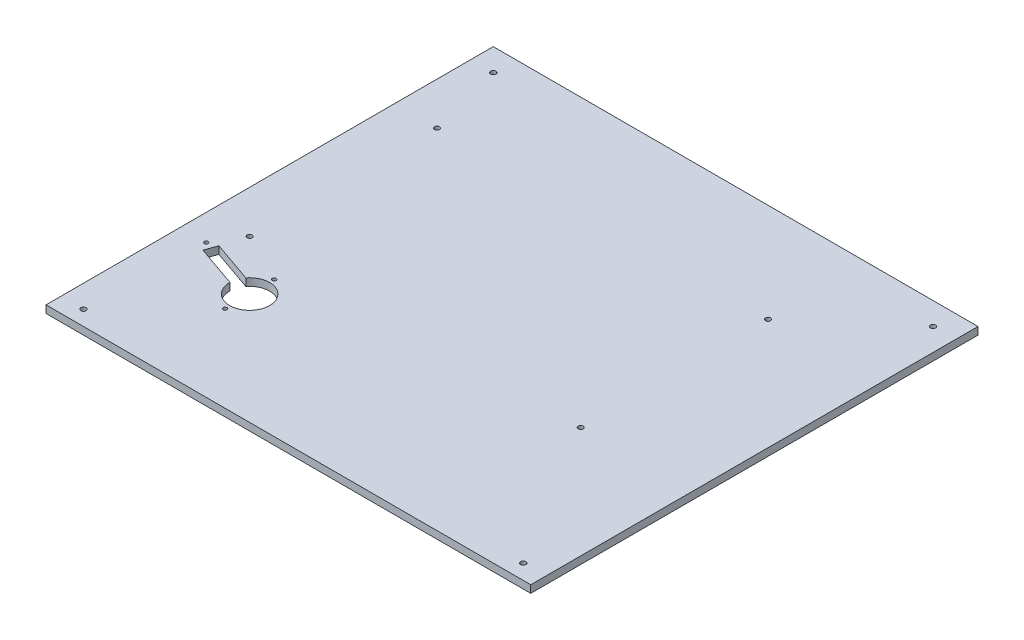
ISO-10303-21;
HEADER;
FILE_DESCRIPTION(('STEP AP214'),'2;1');
FILE_NAME('part.step','',(''),(''),'','','');
FILE_SCHEMA(('AUTOMOTIVE_DESIGN { 1 0 10303 214 1 1 1 1 }'));
ENDSEC;
DATA;
#1=APPLICATION_CONTEXT('core data for automotive mechanical design processes');
#2=APPLICATION_PROTOCOL_DEFINITION('international standard','automotive_design',2000,#1);
#3=PRODUCT_CONTEXT('',#1,'mechanical');
#4=PRODUCT('Part','Part','',(#3));
#5=PRODUCT_RELATED_PRODUCT_CATEGORY('part','',(#4));
#6=PRODUCT_DEFINITION_FORMATION('','',#4);
#7=PRODUCT_DEFINITION_CONTEXT('part definition',#1,'design');
#8=PRODUCT_DEFINITION('design','',#6,#7);
#9=PRODUCT_DEFINITION_SHAPE('','',#8);
#10=(LENGTH_UNIT() NAMED_UNIT(*) SI_UNIT(.MILLI.,.METRE.));
#11=(NAMED_UNIT(*) PLANE_ANGLE_UNIT() SI_UNIT($,.RADIAN.));
#12=(NAMED_UNIT(*) SI_UNIT($,.STERADIAN.) SOLID_ANGLE_UNIT());
#13=UNCERTAINTY_MEASURE_WITH_UNIT(LENGTH_MEASURE(1.E-05),#10,'distance_accuracy_value','');
#14=(GEOMETRIC_REPRESENTATION_CONTEXT(3) GLOBAL_UNCERTAINTY_ASSIGNED_CONTEXT((#13)) GLOBAL_UNIT_ASSIGNED_CONTEXT((#10,
#11,#12)) REPRESENTATION_CONTEXT('',''));
#15=CARTESIAN_POINT('',(0.,0.,0.));
#16=DIRECTION('',(0.,0.,1.));
#17=DIRECTION('',(1.,0.,0.));
#18=AXIS2_PLACEMENT_3D('',#15,#16,#17);
#19=CARTESIAN_POINT('',(0.,6.,0.));
#20=DIRECTION('',(0.,1.,0.));
#21=DIRECTION('',(0.,0.,1.));
#22=AXIS2_PLACEMENT_3D('',#19,#20,#21);
#23=PLANE('',#22);
#24=DIRECTION('',(0.,0.,1.));
#25=VECTOR('',#24,1.);
#26=CARTESIAN_POINT('',(194.,6.,179.));
#27=LINE('',#26,#25);
#28=CARTESIAN_POINT('',(194.,6.,-179.));
#29=VERTEX_POINT('',#28);
#30=CARTESIAN_POINT('',(194.,6.,179.));
#31=VERTEX_POINT('',#30);
#32=EDGE_CURVE('E123',#29,#31,#27,.T.);
#33=ORIENTED_EDGE('',*,*,#32,.F.);
#34=DIRECTION('',(1.,0.,0.));
#35=VECTOR('',#34,1.);
#36=CARTESIAN_POINT('',(194.,6.,-179.));
#37=LINE('',#36,#35);
#38=CARTESIAN_POINT('',(-194.,6.,-179.));
#39=VERTEX_POINT('',#38);
#40=EDGE_CURVE('E129',#39,#29,#37,.T.);
#41=ORIENTED_EDGE('',*,*,#40,.F.);
#42=DIRECTION('',(0.,0.,-1.));
#43=VECTOR('',#42,1.);
#44=CARTESIAN_POINT('',(-194.,6.,-179.));
#45=LINE('',#44,#43);
#46=CARTESIAN_POINT('',(-194.,6.,179.));
#47=VERTEX_POINT('',#46);
#48=EDGE_CURVE('E106',#47,#39,#45,.T.);
#49=ORIENTED_EDGE('',*,*,#48,.F.);
#50=DIRECTION('',(-1.,0.,0.));
#51=VECTOR('',#50,1.);
#52=CARTESIAN_POINT('',(-195.,6.,179.));
#53=LINE('',#52,#51);
#54=EDGE_CURVE('E137',#31,#47,#53,.T.);
#55=ORIENTED_EDGE('',*,*,#54,.F.);
#56=EDGE_LOOP('',(#33,#41,#49,#55));
#57=FACE_BOUND('',#56,.T.);
#58=DIRECTION('',(-0.94497601466594,0.,-0.327139621119298));
#59=VECTOR('',#58,1.);
#60=CARTESIAN_POINT('',(-165.800861457383,6.,68.8531564650416));
#61=LINE('',#60,#59);
#62=CARTESIAN_POINT('',(-132.726704425269,6.,80.3030419990685));
#63=VERTEX_POINT('',#62);
#64=CARTESIAN_POINT('',(-165.800861457383,6.,68.8531564650416));
#65=VERTEX_POINT('',#64);
#66=EDGE_CURVE('E153',#63,#65,#61,.T.);
#67=ORIENTED_EDGE('',*,*,#66,.F.);
#68=CARTESIAN_POINT('',(-120.,6.,90.));
#69=DIRECTION('',(0.,1.,0.));
#70=DIRECTION('',(0.,0.,1.));
#71=AXIS2_PLACEMENT_3D('',#68,#69,#70);
#72=CIRCLE('',#71,16.);
#73=CARTESIAN_POINT('',(-135.998409614238,6.,89.7744122896263));
#74=VERTEX_POINT('',#73);
#75=EDGE_CURVE('E216',#74,#63,#72,.T.);
#76=ORIENTED_EDGE('',*,*,#75,.F.);
#77=DIRECTION('',(0.944784063141577,0.,0.327693567275425));
#78=VECTOR('',#77,1.);
#79=CARTESIAN_POINT('',(-135.998409614238,6.,89.7744122896263));
#80=LINE('',#79,#78);
#81=CARTESIAN_POINT('',(-169.072254333184,6.,78.3029167571695));
#82=VERTEX_POINT('',#81);
#83=EDGE_CURVE('E64',#82,#74,#80,.T.);
#84=ORIENTED_EDGE('',*,*,#83,.F.);
#85=DIRECTION('',(-0.327139318778484,0.,0.944976119332732));
#86=VECTOR('',#85,1.);
#87=CARTESIAN_POINT('',(-169.072254333184,6.,78.3029167571695));
#88=LINE('',#87,#86);
#89=EDGE_CURVE('E152',#65,#82,#88,.T.);
#90=ORIENTED_EDGE('',*,*,#89,.F.);
#91=EDGE_LOOP('',(#67,#76,#84,#90));
#92=FACE_BOUND('',#91,.T.);
#93=CARTESIAN_POINT('',(-120.315809278969,6.,70.0024935429611));
#94=DIRECTION('',(0.,1.,0.));
#95=DIRECTION('',(0.,0.,1.));
#96=AXIS2_PLACEMENT_3D('',#93,#94,#95);
#97=CIRCLE('',#96,1.54999999999999);
#98=CARTESIAN_POINT('',(-120.315809278969,6.,71.5524935429611));
#99=VERTEX_POINT('',#98);
#100=EDGE_CURVE('E171',#99,#99,#97,.T.);
#101=ORIENTED_EDGE('',*,*,#100,.F.);
#102=EDGE_LOOP('',(#101));
#103=FACE_BOUND('',#102,.T.);
#104=CARTESIAN_POINT('',(105.,6.,-99.9999999999999));
#105=DIRECTION('',(0.,1.,0.));
#106=DIRECTION('',(0.,0.,1.));
#107=AXIS2_PLACEMENT_3D('',#104,#105,#106);
#108=CIRCLE('',#107,1.99999999999648);
#109=CARTESIAN_POINT('',(105.,6.,-98.0000000000035));
#110=VERTEX_POINT('',#109);
#111=EDGE_CURVE('E182',#110,#110,#108,.T.);
#112=ORIENTED_EDGE('',*,*,#111,.F.);
#113=EDGE_LOOP('',(#112));
#114=FACE_BOUND('',#113,.T.);
#115=CARTESIAN_POINT('',(-160.,6.,-100.));
#116=DIRECTION('',(0.,1.,0.));
#117=DIRECTION('',(0.,0.,1.));
#118=AXIS2_PLACEMENT_3D('',#115,#116,#117);
#119=CIRCLE('',#118,1.99999999999648);
#120=CARTESIAN_POINT('',(-160.,6.,-98.0000000000035));
#121=VERTEX_POINT('',#120);
#122=EDGE_CURVE('E193',#121,#121,#119,.T.);
#123=ORIENTED_EDGE('',*,*,#122,.F.);
#124=EDGE_LOOP('',(#123));
#125=FACE_BOUND('',#124,.T.);
#126=CARTESIAN_POINT('',(176.,6.,-161.));
#127=DIRECTION('',(0.,1.,0.));
#128=DIRECTION('',(0.,0.,-1.));
#129=AXIS2_PLACEMENT_3D('',#126,#127,#128);
#130=CIRCLE('',#129,2.09999999999999);
#131=CARTESIAN_POINT('',(176.,6.,-163.1));
#132=VERTEX_POINT('',#131);
#133=EDGE_CURVE('E210',#132,#132,#130,.T.);
#134=ORIENTED_EDGE('',*,*,#133,.F.);
#135=EDGE_LOOP('',(#134));
#136=FACE_BOUND('',#135,.T.);
#137=CARTESIAN_POINT('',(-176.,6.,-161.));
#138=DIRECTION('',(0.,1.,0.));
#139=DIRECTION('',(0.,0.,1.));
#140=AXIS2_PLACEMENT_3D('',#137,#138,#139);
#141=CIRCLE('',#140,2.09999999999999);
#142=CARTESIAN_POINT('',(-176.,6.,-158.9));
#143=VERTEX_POINT('',#142);
#144=EDGE_CURVE('E11',#143,#143,#141,.T.);
#145=ORIENTED_EDGE('',*,*,#144,.F.);
#146=EDGE_LOOP('',(#145));
#147=FACE_BOUND('',#146,.T.);
#148=CARTESIAN_POINT('',(-176.,6.,167.));
#149=DIRECTION('',(0.,1.,0.));
#150=DIRECTION('',(0.,0.,1.));
#151=AXIS2_PLACEMENT_3D('',#148,#149,#150);
#152=CIRCLE('',#151,2.09999999999999);
#153=CARTESIAN_POINT('',(-176.,6.,169.1));
#154=VERTEX_POINT('',#153);
#155=EDGE_CURVE('E221',#154,#154,#152,.T.);
#156=ORIENTED_EDGE('',*,*,#155,.F.);
#157=EDGE_LOOP('',(#156));
#158=FACE_BOUND('',#157,.T.);
#159=CARTESIAN_POINT('',(176.,6.,167.));
#160=DIRECTION('',(0.,1.,0.));
#161=DIRECTION('',(0.,0.,-1.));
#162=AXIS2_PLACEMENT_3D('',#159,#160,#161);
#163=CIRCLE('',#162,2.09999999999999);
#164=CARTESIAN_POINT('',(176.,6.,164.9));
#165=VERTEX_POINT('',#164);
#166=EDGE_CURVE('E215',#165,#165,#163,.T.);
#167=ORIENTED_EDGE('',*,*,#166,.F.);
#168=EDGE_LOOP('',(#167));
#169=FACE_BOUND('',#168,.T.);
#170=CARTESIAN_POINT('',(-160.,6.,50.));
#171=DIRECTION('',(0.,1.,0.));
#172=DIRECTION('',(0.,0.,1.));
#173=AXIS2_PLACEMENT_3D('',#170,#171,#172);
#174=CIRCLE('',#173,1.99999999999648);
#175=CARTESIAN_POINT('',(-160.,6.,51.9999999999965));
#176=VERTEX_POINT('',#175);
#177=EDGE_CURVE('E202',#176,#176,#174,.T.);
#178=ORIENTED_EDGE('',*,*,#177,.F.);
#179=EDGE_LOOP('',(#178));
#180=FACE_BOUND('',#179,.T.);
#181=CARTESIAN_POINT('',(105.,6.,50.));
#182=DIRECTION('',(0.,1.,0.));
#183=DIRECTION('',(0.,0.,1.));
#184=AXIS2_PLACEMENT_3D('',#181,#182,#183);
#185=CIRCLE('',#184,1.99999999999648);
#186=CARTESIAN_POINT('',(105.,6.,51.9999999999965));
#187=VERTEX_POINT('',#186);
#188=EDGE_CURVE('E186',#187,#187,#185,.T.);
#189=ORIENTED_EDGE('',*,*,#188,.F.);
#190=EDGE_LOOP('',(#189));
#191=FACE_BOUND('',#190,.T.);
#192=CARTESIAN_POINT('',(-119.684190721031,6.,109.997506457039));
#193=DIRECTION('',(0.,1.,0.));
#194=DIRECTION('',(0.,0.,1.));
#195=AXIS2_PLACEMENT_3D('',#192,#193,#194);
#196=CIRCLE('',#195,1.54999999999999);
#197=CARTESIAN_POINT('',(-119.684190721031,6.,111.547506457039));
#198=VERTEX_POINT('',#197);
#199=EDGE_CURVE('E180',#198,#198,#196,.T.);
#200=ORIENTED_EDGE('',*,*,#199,.F.);
#201=EDGE_LOOP('',(#200));
#202=FACE_BOUND('',#201,.T.);
#203=CARTESIAN_POINT('',(-173.10641461128,6.,71.6152006984346));
#204=DIRECTION('',(0.,1.,0.));
#205=DIRECTION('',(0.,0.,1.));
#206=AXIS2_PLACEMENT_3D('',#203,#204,#205);
#207=CIRCLE('',#206,1.5500000000041);
#208=CARTESIAN_POINT('',(-173.10641461128,6.,73.1652006984388));
#209=VERTEX_POINT('',#208);
#210=EDGE_CURVE('E164',#209,#209,#207,.T.);
#211=ORIENTED_EDGE('',*,*,#210,.F.);
#212=EDGE_LOOP('',(#211));
#213=FACE_BOUND('',#212,.T.);
#214=ADVANCED_FACE('F39',(#57,#92,#103,#114,#125,#136,#147,#158,#169,#180,#191,#202,#213),#23,.T.);
#215=CARTESIAN_POINT('',(0.,0.,0.));
#216=DIRECTION('',(0.,1.,0.));
#217=DIRECTION('',(0.,0.,1.));
#218=AXIS2_PLACEMENT_3D('',#215,#216,#217);
#219=PLANE('',#218);
#220=DIRECTION('',(1.,0.,0.));
#221=VECTOR('',#220,1.);
#222=CARTESIAN_POINT('',(194.,0.,-179.));
#223=LINE('',#222,#221);
#224=CARTESIAN_POINT('',(-194.,0.,-179.));
#225=VERTEX_POINT('',#224);
#226=CARTESIAN_POINT('',(194.,0.,-179.));
#227=VERTEX_POINT('',#226);
#228=EDGE_CURVE('E112',#225,#227,#223,.T.);
#229=ORIENTED_EDGE('',*,*,#228,.T.);
#230=DIRECTION('',(0.,0.,1.));
#231=VECTOR('',#230,1.);
#232=CARTESIAN_POINT('',(194.,0.,179.));
#233=LINE('',#232,#231);
#234=CARTESIAN_POINT('',(194.,0.,179.));
#235=VERTEX_POINT('',#234);
#236=EDGE_CURVE('E118',#227,#235,#233,.T.);
#237=ORIENTED_EDGE('',*,*,#236,.T.);
#238=DIRECTION('',(-1.,0.,0.));
#239=VECTOR('',#238,1.);
#240=CARTESIAN_POINT('',(-195.,0.,179.));
#241=LINE('',#240,#239);
#242=CARTESIAN_POINT('',(-194.,0.,179.));
#243=VERTEX_POINT('',#242);
#244=EDGE_CURVE('E121',#235,#243,#241,.T.);
#245=ORIENTED_EDGE('',*,*,#244,.T.);
#246=DIRECTION('',(0.,0.,-1.));
#247=VECTOR('',#246,1.);
#248=CARTESIAN_POINT('',(-194.,0.,-179.));
#249=LINE('',#248,#247);
#250=EDGE_CURVE('E53',#243,#225,#249,.T.);
#251=ORIENTED_EDGE('',*,*,#250,.T.);
#252=EDGE_LOOP('',(#229,#237,#245,#251));
#253=FACE_BOUND('',#252,.T.);
#254=CARTESIAN_POINT('',(-176.,0.,-161.));
#255=DIRECTION('',(0.,1.,0.));
#256=DIRECTION('',(0.,0.,1.));
#257=AXIS2_PLACEMENT_3D('',#254,#255,#256);
#258=CIRCLE('',#257,2.09999999999999);
#259=CARTESIAN_POINT('',(-176.,0.,-158.9));
#260=VERTEX_POINT('',#259);
#261=EDGE_CURVE('E43',#260,#260,#258,.T.);
#262=ORIENTED_EDGE('',*,*,#261,.T.);
#263=EDGE_LOOP('',(#262));
#264=FACE_BOUND('',#263,.T.);
#265=CARTESIAN_POINT('',(-176.,0.,167.));
#266=DIRECTION('',(0.,1.,0.));
#267=DIRECTION('',(0.,0.,1.));
#268=AXIS2_PLACEMENT_3D('',#265,#266,#267);
#269=CIRCLE('',#268,2.09999999999999);
#270=CARTESIAN_POINT('',(-176.,0.,169.1));
#271=VERTEX_POINT('',#270);
#272=EDGE_CURVE('E225',#271,#271,#269,.T.);
#273=ORIENTED_EDGE('',*,*,#272,.T.);
#274=EDGE_LOOP('',(#273));
#275=FACE_BOUND('',#274,.T.);
#276=CARTESIAN_POINT('',(-120.,0.,90.));
#277=DIRECTION('',(0.,1.,0.));
#278=DIRECTION('',(0.,0.,1.));
#279=AXIS2_PLACEMENT_3D('',#276,#277,#278);
#280=CIRCLE('',#279,16.);
#281=CARTESIAN_POINT('',(-135.998409614238,0.,89.7744122896263));
#282=VERTEX_POINT('',#281);
#283=CARTESIAN_POINT('',(-132.726704425269,0.,80.3030419990685));
#284=VERTEX_POINT('',#283);
#285=EDGE_CURVE('E217',#282,#284,#280,.T.);
#286=ORIENTED_EDGE('',*,*,#285,.T.);
#287=DIRECTION('',(0.94497601466594,0.,0.327139621119298));
#288=VECTOR('',#287,1.);
#289=CARTESIAN_POINT('',(-165.800861457383,0.,68.8531564650416));
#290=LINE('',#289,#288);
#291=CARTESIAN_POINT('',(-165.800861457383,0.,68.8531564650416));
#292=VERTEX_POINT('',#291);
#293=EDGE_CURVE('E146',#292,#284,#290,.T.);
#294=ORIENTED_EDGE('',*,*,#293,.F.);
#295=DIRECTION('',(0.327139318778484,0.,-0.944976119332732));
#296=VECTOR('',#295,1.);
#297=CARTESIAN_POINT('',(-169.072254333184,0.,78.3029167571695));
#298=LINE('',#297,#296);
#299=CARTESIAN_POINT('',(-169.072254333184,0.,78.3029167571695));
#300=VERTEX_POINT('',#299);
#301=EDGE_CURVE('E149',#300,#292,#298,.T.);
#302=ORIENTED_EDGE('',*,*,#301,.F.);
#303=DIRECTION('',(-0.944784063141577,0.,-0.327693567275425));
#304=VECTOR('',#303,1.);
#305=CARTESIAN_POINT('',(-135.998409614238,0.,89.7744122896263));
#306=LINE('',#305,#304);
#307=EDGE_CURVE('E163',#282,#300,#306,.T.);
#308=ORIENTED_EDGE('',*,*,#307,.F.);
#309=EDGE_LOOP('',(#286,#294,#302,#308));
#310=FACE_BOUND('',#309,.T.);
#311=CARTESIAN_POINT('',(176.,0.,167.));
#312=DIRECTION('',(0.,1.,0.));
#313=DIRECTION('',(0.,0.,-1.));
#314=AXIS2_PLACEMENT_3D('',#311,#312,#313);
#315=CIRCLE('',#314,2.09999999999999);
#316=CARTESIAN_POINT('',(176.,0.,164.9));
#317=VERTEX_POINT('',#316);
#318=EDGE_CURVE('E208',#317,#317,#315,.T.);
#319=ORIENTED_EDGE('',*,*,#318,.T.);
#320=EDGE_LOOP('',(#319));
#321=FACE_BOUND('',#320,.T.);
#322=CARTESIAN_POINT('',(176.,0.,-161.));
#323=DIRECTION('',(0.,1.,0.));
#324=DIRECTION('',(0.,0.,-1.));
#325=AXIS2_PLACEMENT_3D('',#322,#323,#324);
#326=CIRCLE('',#325,2.09999999999999);
#327=CARTESIAN_POINT('',(176.,0.,-163.1));
#328=VERTEX_POINT('',#327);
#329=EDGE_CURVE('E204',#328,#328,#326,.T.);
#330=ORIENTED_EDGE('',*,*,#329,.T.);
#331=EDGE_LOOP('',(#330));
#332=FACE_BOUND('',#331,.T.);
#333=CARTESIAN_POINT('',(-160.,0.,50.));
#334=DIRECTION('',(0.,1.,0.));
#335=DIRECTION('',(0.,0.,1.));
#336=AXIS2_PLACEMENT_3D('',#333,#334,#335);
#337=CIRCLE('',#336,1.99999999999648);
#338=CARTESIAN_POINT('',(-160.,0.,51.9999999999965));
#339=VERTEX_POINT('',#338);
#340=EDGE_CURVE('E200',#339,#339,#337,.T.);
#341=ORIENTED_EDGE('',*,*,#340,.T.);
#342=EDGE_LOOP('',(#341));
#343=FACE_BOUND('',#342,.T.);
#344=CARTESIAN_POINT('',(-160.,0.,-100.));
#345=DIRECTION('',(0.,1.,0.));
#346=DIRECTION('',(0.,0.,1.));
#347=AXIS2_PLACEMENT_3D('',#344,#345,#346);
#348=CIRCLE('',#347,1.99999999999648);
#349=CARTESIAN_POINT('',(-160.,0.,-98.0000000000035));
#350=VERTEX_POINT('',#349);
#351=EDGE_CURVE('E194',#350,#350,#348,.T.);
#352=ORIENTED_EDGE('',*,*,#351,.T.);
#353=EDGE_LOOP('',(#352));
#354=FACE_BOUND('',#353,.T.);
#355=CARTESIAN_POINT('',(105.,0.,50.));
#356=DIRECTION('',(0.,1.,0.));
#357=DIRECTION('',(0.,0.,1.));
#358=AXIS2_PLACEMENT_3D('',#355,#356,#357);
#359=CIRCLE('',#358,1.99999999999648);
#360=CARTESIAN_POINT('',(105.,0.,51.9999999999965));
#361=VERTEX_POINT('',#360);
#362=EDGE_CURVE('E187',#361,#361,#359,.T.);
#363=ORIENTED_EDGE('',*,*,#362,.T.);
#364=EDGE_LOOP('',(#363));
#365=FACE_BOUND('',#364,.T.);
#366=CARTESIAN_POINT('',(105.,0.,-99.9999999999999));
#367=DIRECTION('',(0.,1.,0.));
#368=DIRECTION('',(0.,0.,1.));
#369=AXIS2_PLACEMENT_3D('',#366,#367,#368);
#370=CIRCLE('',#369,1.99999999999648);
#371=CARTESIAN_POINT('',(105.,0.,-98.0000000000035));
#372=VERTEX_POINT('',#371);
#373=EDGE_CURVE('E179',#372,#372,#370,.T.);
#374=ORIENTED_EDGE('',*,*,#373,.T.);
#375=EDGE_LOOP('',(#374));
#376=FACE_BOUND('',#375,.T.);
#377=CARTESIAN_POINT('',(-119.684190721031,0.,109.997506457039));
#378=DIRECTION('',(0.,1.,0.));
#379=DIRECTION('',(0.,0.,1.));
#380=AXIS2_PLACEMENT_3D('',#377,#378,#379);
#381=CIRCLE('',#380,1.54999999999999);
#382=CARTESIAN_POINT('',(-119.684190721031,0.,111.547506457039));
#383=VERTEX_POINT('',#382);
#384=EDGE_CURVE('E172',#383,#383,#381,.T.);
#385=ORIENTED_EDGE('',*,*,#384,.T.);
#386=EDGE_LOOP('',(#385));
#387=FACE_BOUND('',#386,.T.);
#388=CARTESIAN_POINT('',(-120.315809278969,0.,70.0024935429611));
#389=DIRECTION('',(0.,1.,0.));
#390=DIRECTION('',(0.,0.,1.));
#391=AXIS2_PLACEMENT_3D('',#388,#389,#390);
#392=CIRCLE('',#391,1.54999999999999);
#393=CARTESIAN_POINT('',(-120.315809278969,0.,71.5524935429611));
#394=VERTEX_POINT('',#393);
#395=EDGE_CURVE('E166',#394,#394,#392,.T.);
#396=ORIENTED_EDGE('',*,*,#395,.T.);
#397=EDGE_LOOP('',(#396));
#398=FACE_BOUND('',#397,.T.);
#399=CARTESIAN_POINT('',(-173.10641461128,0.,71.6152006984346));
#400=DIRECTION('',(0.,1.,0.));
#401=DIRECTION('',(0.,0.,1.));
#402=AXIS2_PLACEMENT_3D('',#399,#400,#401);
#403=CIRCLE('',#402,1.5500000000041);
#404=CARTESIAN_POINT('',(-173.10641461128,0.,73.1652006984388));
#405=VERTEX_POINT('',#404);
#406=EDGE_CURVE('E165',#405,#405,#403,.T.);
#407=ORIENTED_EDGE('',*,*,#406,.T.);
#408=EDGE_LOOP('',(#407));
#409=FACE_BOUND('',#408,.T.);
#410=ADVANCED_FACE('F41',(#253,#264,#275,#310,#321,#332,#343,#354,#365,#376,#387,#398,#409),
#219,.F.);
#411=CARTESIAN_POINT('',(-176.,6.,-161.));
#412=DIRECTION('',(0.,-1.,0.));
#413=DIRECTION('',(0.,0.,-1.));
#414=AXIS2_PLACEMENT_3D('',#411,#412,#413);
#415=CYLINDRICAL_SURFACE('',#414,2.09999999999999);
#416=ORIENTED_EDGE('',*,*,#144,.T.);
#417=EDGE_LOOP('',(#416));
#418=FACE_BOUND('',#417,.T.);
#419=ORIENTED_EDGE('',*,*,#261,.F.);
#420=EDGE_LOOP('',(#419));
#421=FACE_BOUND('',#420,.T.);
#422=ADVANCED_FACE('F236',(#418,#421),#415,.F.);
#423=CARTESIAN_POINT('',(-176.,6.,167.));
#424=DIRECTION('',(0.,-1.,0.));
#425=DIRECTION('',(0.,0.,-1.));
#426=AXIS2_PLACEMENT_3D('',#423,#424,#425);
#427=CYLINDRICAL_SURFACE('',#426,2.09999999999999);
#428=ORIENTED_EDGE('',*,*,#155,.T.);
#429=EDGE_LOOP('',(#428));
#430=FACE_BOUND('',#429,.T.);
#431=ORIENTED_EDGE('',*,*,#272,.F.);
#432=EDGE_LOOP('',(#431));
#433=FACE_BOUND('',#432,.T.);
#434=ADVANCED_FACE('F231',(#430,#433),#427,.F.);
#435=CARTESIAN_POINT('',(-120.,6.,90.));
#436=DIRECTION('',(0.,-1.,0.));
#437=DIRECTION('',(0.,0.,-1.));
#438=AXIS2_PLACEMENT_3D('',#435,#436,#437);
#439=CYLINDRICAL_SURFACE('',#438,16.);
#440=DIRECTION('',(0.,-1.,0.));
#441=VECTOR('',#440,1.);
#442=CARTESIAN_POINT('',(-132.726704425269,6.,80.3030419990685));
#443=LINE('',#442,#441);
#444=EDGE_CURVE('E144',#63,#284,#443,.T.);
#445=ORIENTED_EDGE('',*,*,#444,.T.);
#446=ORIENTED_EDGE('',*,*,#285,.F.);
#447=DIRECTION('',(0.,-1.,0.));
#448=VECTOR('',#447,1.);
#449=CARTESIAN_POINT('',(-135.998409614238,6.,89.7744122896263));
#450=LINE('',#449,#448);
#451=EDGE_CURVE('E136',#282,#74,#450,.F.);
#452=ORIENTED_EDGE('',*,*,#451,.T.);
#453=ORIENTED_EDGE('',*,*,#75,.T.);
#454=EDGE_LOOP('',(#445,#446,#452,#453));
#455=FACE_BOUND('',#454,.T.);
#456=ADVANCED_FACE('F232',(#455),#439,.F.);
#457=CARTESIAN_POINT('',(176.,6.,167.));
#458=DIRECTION('',(0.,-1.,0.));
#459=DIRECTION('',(0.,0.,-1.));
#460=AXIS2_PLACEMENT_3D('',#457,#458,#459);
#461=CYLINDRICAL_SURFACE('',#460,2.09999999999999);
#462=ORIENTED_EDGE('',*,*,#166,.T.);
#463=EDGE_LOOP('',(#462));
#464=FACE_BOUND('',#463,.T.);
#465=ORIENTED_EDGE('',*,*,#318,.F.);
#466=EDGE_LOOP('',(#465));
#467=FACE_BOUND('',#466,.T.);
#468=ADVANCED_FACE('F242',(#464,#467),#461,.F.);
#469=CARTESIAN_POINT('',(176.,6.,-161.));
#470=DIRECTION('',(0.,-1.,0.));
#471=DIRECTION('',(0.,0.,-1.));
#472=AXIS2_PLACEMENT_3D('',#469,#470,#471);
#473=CYLINDRICAL_SURFACE('',#472,2.09999999999999);
#474=ORIENTED_EDGE('',*,*,#133,.T.);
#475=EDGE_LOOP('',(#474));
#476=FACE_BOUND('',#475,.T.);
#477=ORIENTED_EDGE('',*,*,#329,.F.);
#478=EDGE_LOOP('',(#477));
#479=FACE_BOUND('',#478,.T.);
#480=ADVANCED_FACE('F324',(#476,#479),#473,.F.);
#481=CARTESIAN_POINT('',(-160.,6.,50.));
#482=DIRECTION('',(0.,-1.,0.));
#483=DIRECTION('',(0.,0.,-1.));
#484=AXIS2_PLACEMENT_3D('',#481,#482,#483);
#485=CYLINDRICAL_SURFACE('',#484,1.99999999999648);
#486=ORIENTED_EDGE('',*,*,#177,.T.);
#487=EDGE_LOOP('',(#486));
#488=FACE_BOUND('',#487,.T.);
#489=ORIENTED_EDGE('',*,*,#340,.F.);
#490=EDGE_LOOP('',(#489));
#491=FACE_BOUND('',#490,.T.);
#492=ADVANCED_FACE('F319',(#488,#491),#485,.F.);
#493=CARTESIAN_POINT('',(-160.,6.,-100.));
#494=DIRECTION('',(0.,-1.,0.));
#495=DIRECTION('',(0.,0.,-1.));
#496=AXIS2_PLACEMENT_3D('',#493,#494,#495);
#497=CYLINDRICAL_SURFACE('',#496,1.99999999999648);
#498=ORIENTED_EDGE('',*,*,#122,.T.);
#499=EDGE_LOOP('',(#498));
#500=FACE_BOUND('',#499,.T.);
#501=ORIENTED_EDGE('',*,*,#351,.F.);
#502=EDGE_LOOP('',(#501));
#503=FACE_BOUND('',#502,.T.);
#504=ADVANCED_FACE('F313',(#500,#503),#497,.F.);
#505=CARTESIAN_POINT('',(105.,6.,50.));
#506=DIRECTION('',(0.,-1.,0.));
#507=DIRECTION('',(0.,0.,-1.));
#508=AXIS2_PLACEMENT_3D('',#505,#506,#507);
#509=CYLINDRICAL_SURFACE('',#508,1.99999999999648);
#510=ORIENTED_EDGE('',*,*,#188,.T.);
#511=EDGE_LOOP('',(#510));
#512=FACE_BOUND('',#511,.T.);
#513=ORIENTED_EDGE('',*,*,#362,.F.);
#514=EDGE_LOOP('',(#513));
#515=FACE_BOUND('',#514,.T.);
#516=ADVANCED_FACE('F309',(#512,#515),#509,.F.);
#517=CARTESIAN_POINT('',(105.,6.,-99.9999999999999));
#518=DIRECTION('',(0.,-1.,0.));
#519=DIRECTION('',(0.,0.,-1.));
#520=AXIS2_PLACEMENT_3D('',#517,#518,#519);
#521=CYLINDRICAL_SURFACE('',#520,1.99999999999648);
#522=ORIENTED_EDGE('',*,*,#111,.T.);
#523=EDGE_LOOP('',(#522));
#524=FACE_BOUND('',#523,.T.);
#525=ORIENTED_EDGE('',*,*,#373,.F.);
#526=EDGE_LOOP('',(#525));
#527=FACE_BOUND('',#526,.T.);
#528=ADVANCED_FACE('F306',(#524,#527),#521,.F.);
#529=CARTESIAN_POINT('',(-119.684190721031,6.,109.997506457039));
#530=DIRECTION('',(0.,-1.,0.));
#531=DIRECTION('',(0.,0.,-1.));
#532=AXIS2_PLACEMENT_3D('',#529,#530,#531);
#533=CYLINDRICAL_SURFACE('',#532,1.54999999999999);
#534=ORIENTED_EDGE('',*,*,#199,.T.);
#535=EDGE_LOOP('',(#534));
#536=FACE_BOUND('',#535,.T.);
#537=ORIENTED_EDGE('',*,*,#384,.F.);
#538=EDGE_LOOP('',(#537));
#539=FACE_BOUND('',#538,.T.);
#540=ADVANCED_FACE('F299',(#536,#539),#533,.F.);
#541=CARTESIAN_POINT('',(-120.315809278969,6.,70.0024935429611));
#542=DIRECTION('',(0.,-1.,0.));
#543=DIRECTION('',(0.,0.,-1.));
#544=AXIS2_PLACEMENT_3D('',#541,#542,#543);
#545=CYLINDRICAL_SURFACE('',#544,1.54999999999999);
#546=ORIENTED_EDGE('',*,*,#100,.T.);
#547=EDGE_LOOP('',(#546));
#548=FACE_BOUND('',#547,.T.);
#549=ORIENTED_EDGE('',*,*,#395,.F.);
#550=EDGE_LOOP('',(#549));
#551=FACE_BOUND('',#550,.T.);
#552=ADVANCED_FACE('F288',(#548,#551),#545,.F.);
#553=CARTESIAN_POINT('',(-173.10641461128,6.,71.6152006984346));
#554=DIRECTION('',(0.,-1.,0.));
#555=DIRECTION('',(0.,0.,-1.));
#556=AXIS2_PLACEMENT_3D('',#553,#554,#555);
#557=CYLINDRICAL_SURFACE('',#556,1.5500000000041);
#558=ORIENTED_EDGE('',*,*,#210,.T.);
#559=EDGE_LOOP('',(#558));
#560=FACE_BOUND('',#559,.T.);
#561=ORIENTED_EDGE('',*,*,#406,.F.);
#562=EDGE_LOOP('',(#561));
#563=FACE_BOUND('',#562,.T.);
#564=ADVANCED_FACE('F281',(#560,#563),#557,.F.);
#565=CARTESIAN_POINT('',(-169.072254333184,-0.00100000000000013,78.3029167571695));
#566=DIRECTION('',(-0.944976119332732,0.,-0.327139318778484));
#567=DIRECTION('',(-0.327139318778484,0.,0.944976119332732));
#568=AXIS2_PLACEMENT_3D('',#565,#566,#567);
#569=PLANE('',#568);
#570=ORIENTED_EDGE('',*,*,#301,.T.);
#571=DIRECTION('',(0.,1.,0.));
#572=VECTOR('',#571,1.);
#573=CARTESIAN_POINT('',(-165.800861457383,-0.00100000000000013,68.8531564650416));
#574=LINE('',#573,#572);
#575=EDGE_CURVE('E159',#292,#65,#574,.T.);
#576=ORIENTED_EDGE('',*,*,#575,.T.);
#577=ORIENTED_EDGE('',*,*,#89,.T.);
#578=DIRECTION('',(0.,1.,0.));
#579=VECTOR('',#578,1.);
#580=CARTESIAN_POINT('',(-169.072254333184,-0.00100000000000013,78.3029167571695));
#581=LINE('',#580,#579);
#582=EDGE_CURVE('E158',#300,#82,#581,.T.);
#583=ORIENTED_EDGE('',*,*,#582,.F.);
#584=EDGE_LOOP('',(#570,#576,#577,#583));
#585=FACE_BOUND('',#584,.T.);
#586=ADVANCED_FACE('F290',(#585),#569,.F.);
#587=CARTESIAN_POINT('',(-165.800861457383,-0.00100000000000013,68.8531564650416));
#588=DIRECTION('',(0.327139621119298,0.,-0.94497601466594));
#589=DIRECTION('',(-0.94497601466594,0.,-0.327139621119298));
#590=AXIS2_PLACEMENT_3D('',#587,#588,#589);
#591=PLANE('',#590);
#592=ORIENTED_EDGE('',*,*,#293,.T.);
#593=ORIENTED_EDGE('',*,*,#444,.F.);
#594=ORIENTED_EDGE('',*,*,#66,.T.);
#595=ORIENTED_EDGE('',*,*,#575,.F.);
#596=EDGE_LOOP('',(#592,#593,#594,#595));
#597=FACE_BOUND('',#596,.T.);
#598=ADVANCED_FACE('F298',(#597),#591,.F.);
#599=CARTESIAN_POINT('',(-135.998409614238,-0.00100000000000013,89.7744122896263));
#600=DIRECTION('',(-0.327693567275425,0.,0.944784063141577));
#601=DIRECTION('',(0.944784063141577,0.,0.327693567275425));
#602=AXIS2_PLACEMENT_3D('',#599,#600,#601);
#603=PLANE('',#602);
#604=ORIENTED_EDGE('',*,*,#307,.T.);
#605=ORIENTED_EDGE('',*,*,#582,.T.);
#606=ORIENTED_EDGE('',*,*,#83,.T.);
#607=ORIENTED_EDGE('',*,*,#451,.F.);
#608=EDGE_LOOP('',(#604,#605,#606,#607));
#609=FACE_BOUND('',#608,.T.);
#610=ADVANCED_FACE('F408',(#609),#603,.F.);
#611=CARTESIAN_POINT('',(-195.,0.,179.));
#612=DIRECTION('',(0.,0.,-1.));
#613=DIRECTION('',(-1.,0.,0.));
#614=AXIS2_PLACEMENT_3D('',#611,#612,#613);
#615=PLANE('',#614);
#616=ORIENTED_EDGE('',*,*,#244,.F.);
#617=DIRECTION('',(0.,1.,0.));
#618=VECTOR('',#617,1.);
#619=CARTESIAN_POINT('',(194.,0.,179.));
#620=LINE('',#619,#618);
#621=EDGE_CURVE('E135',#235,#31,#620,.T.);
#622=ORIENTED_EDGE('',*,*,#621,.T.);
#623=ORIENTED_EDGE('',*,*,#54,.T.);
#624=DIRECTION('',(0.,1.,0.));
#625=VECTOR('',#624,1.);
#626=CARTESIAN_POINT('',(-194.,0.,179.));
#627=LINE('',#626,#625);
#628=EDGE_CURVE('E111',#243,#47,#627,.T.);
#629=ORIENTED_EDGE('',*,*,#628,.F.);
#630=EDGE_LOOP('',(#616,#622,#623,#629));
#631=FACE_BOUND('',#630,.T.);
#632=ADVANCED_FACE('F419',(#631),#615,.F.);
#633=CARTESIAN_POINT('',(194.,0.,179.));
#634=DIRECTION('',(-1.,0.,0.));
#635=DIRECTION('',(0.,0.,1.));
#636=AXIS2_PLACEMENT_3D('',#633,#634,#635);
#637=PLANE('',#636);
#638=ORIENTED_EDGE('',*,*,#32,.T.);
#639=ORIENTED_EDGE('',*,*,#621,.F.);
#640=ORIENTED_EDGE('',*,*,#236,.F.);
#641=DIRECTION('',(0.,1.,0.));
#642=VECTOR('',#641,1.);
#643=CARTESIAN_POINT('',(194.,0.,-179.));
#644=LINE('',#643,#642);
#645=EDGE_CURVE('E109',#227,#29,#644,.T.);
#646=ORIENTED_EDGE('',*,*,#645,.T.);
#647=EDGE_LOOP('',(#638,#639,#640,#646));
#648=FACE_BOUND('',#647,.T.);
#649=ADVANCED_FACE('F430',(#648),#637,.F.);
#650=CARTESIAN_POINT('',(194.,0.,-179.));
#651=DIRECTION('',(0.,0.,1.));
#652=DIRECTION('',(1.,0.,0.));
#653=AXIS2_PLACEMENT_3D('',#650,#651,#652);
#654=PLANE('',#653);
#655=ORIENTED_EDGE('',*,*,#40,.T.);
#656=ORIENTED_EDGE('',*,*,#645,.F.);
#657=ORIENTED_EDGE('',*,*,#228,.F.);
#658=DIRECTION('',(0.,1.,0.));
#659=VECTOR('',#658,1.);
#660=CARTESIAN_POINT('',(-194.,0.,-179.));
#661=LINE('',#660,#659);
#662=EDGE_CURVE('E105',#225,#39,#661,.T.);
#663=ORIENTED_EDGE('',*,*,#662,.T.);
#664=EDGE_LOOP('',(#655,#656,#657,#663));
#665=FACE_BOUND('',#664,.T.);
#666=ADVANCED_FACE('F114',(#665),#654,.F.);
#667=CARTESIAN_POINT('',(-194.,0.,-179.));
#668=DIRECTION('',(1.,0.,0.));
#669=DIRECTION('',(0.,0.,-1.));
#670=AXIS2_PLACEMENT_3D('',#667,#668,#669);
#671=PLANE('',#670);
#672=ORIENTED_EDGE('',*,*,#48,.T.);
#673=ORIENTED_EDGE('',*,*,#662,.F.);
#674=ORIENTED_EDGE('',*,*,#250,.F.);
#675=ORIENTED_EDGE('',*,*,#628,.T.);
#676=EDGE_LOOP('',(#672,#673,#674,#675));
#677=FACE_BOUND('',#676,.T.);
#678=ADVANCED_FACE('F104',(#677),#671,.F.);
#679=CLOSED_SHELL('',(#214,#410,#422,#434,#456,#468,#480,#492,#504,#516,#528,#540,#552,#564,
#586,#598,#610,#632,#649,#666,#678));
#680=MANIFOLD_SOLID_BREP('B2',#679);
#681=ADVANCED_BREP_SHAPE_REPRESENTATION('',(#18,#680),#14);
#682=SHAPE_DEFINITION_REPRESENTATION(#9,#681);
ENDSEC;
END-ISO-10303-21;
